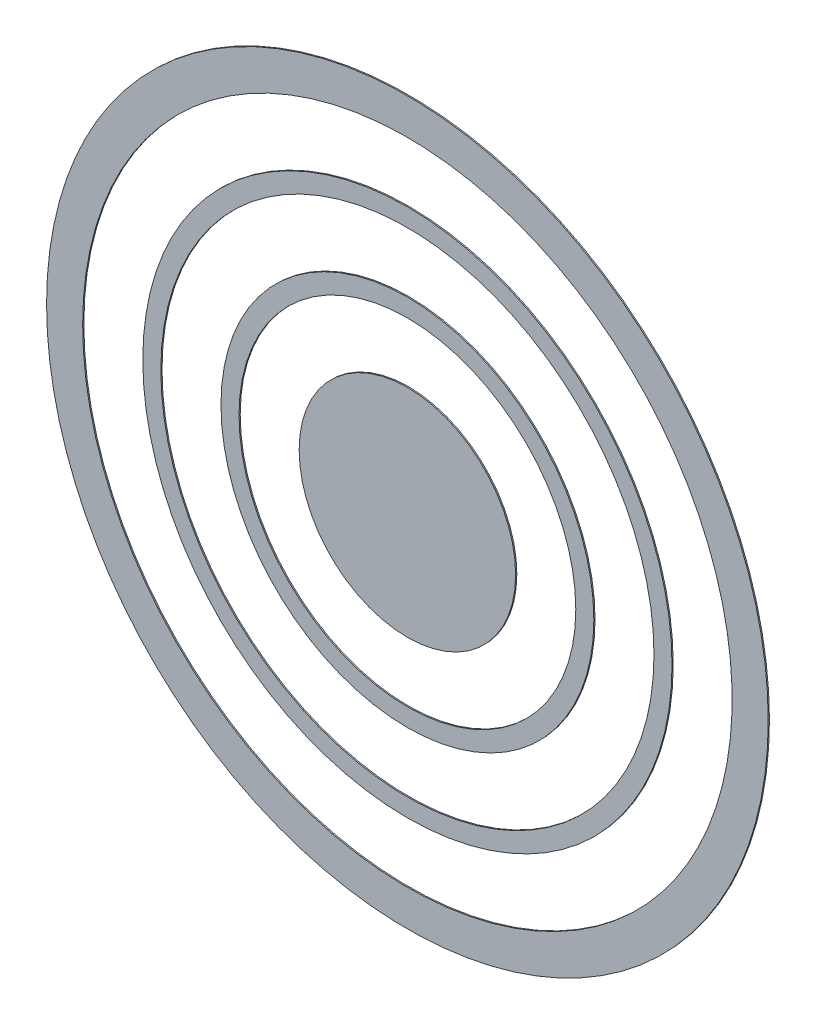
ISO-10303-21;
HEADER;
FILE_DESCRIPTION(('STEP AP214'),'2;1');
FILE_NAME('part.step','',(''),(''),'','','');
FILE_SCHEMA(('AUTOMOTIVE_DESIGN { 1 0 10303 214 1 1 1 1 }'));
ENDSEC;
DATA;
#1=APPLICATION_CONTEXT('core data for automotive mechanical design processes');
#2=APPLICATION_PROTOCOL_DEFINITION('international standard','automotive_design',2000,#1);
#3=PRODUCT_CONTEXT('',#1,'mechanical');
#4=PRODUCT('Part','Part','',(#3));
#5=PRODUCT_RELATED_PRODUCT_CATEGORY('part','',(#4));
#6=PRODUCT_DEFINITION_FORMATION('','',#4);
#7=PRODUCT_DEFINITION_CONTEXT('part definition',#1,'design');
#8=PRODUCT_DEFINITION('design','',#6,#7);
#9=PRODUCT_DEFINITION_SHAPE('','',#8);
#10=(LENGTH_UNIT() NAMED_UNIT(*) SI_UNIT(.MILLI.,.METRE.));
#11=(NAMED_UNIT(*) PLANE_ANGLE_UNIT() SI_UNIT($,.RADIAN.));
#12=(NAMED_UNIT(*) SI_UNIT($,.STERADIAN.) SOLID_ANGLE_UNIT());
#13=UNCERTAINTY_MEASURE_WITH_UNIT(LENGTH_MEASURE(1.E-05),#10,'distance_accuracy_value','');
#14=(GEOMETRIC_REPRESENTATION_CONTEXT(3) GLOBAL_UNCERTAINTY_ASSIGNED_CONTEXT((#13)) GLOBAL_UNIT_ASSIGNED_CONTEXT((#10,
#11,#12)) REPRESENTATION_CONTEXT('',''));
#15=CARTESIAN_POINT('',(0.,0.,0.));
#16=DIRECTION('',(0.,0.,1.));
#17=DIRECTION('',(1.,0.,0.));
#18=AXIS2_PLACEMENT_3D('',#15,#16,#17);
#19=CARTESIAN_POINT('',(0.,0.,0.01));
#20=DIRECTION('',(0.,0.,-1.));
#21=DIRECTION('',(-1.,0.,0.));
#22=AXIS2_PLACEMENT_3D('',#19,#20,#21);
#23=CYLINDRICAL_SURFACE('',#22,0.9);
#24=CARTESIAN_POINT('',(0.,0.,0.01));
#25=DIRECTION('',(0.,0.,1.));
#26=DIRECTION('',(1.,0.,0.));
#27=AXIS2_PLACEMENT_3D('',#24,#25,#26);
#28=CIRCLE('',#27,0.9);
#29=CARTESIAN_POINT('',(-0.9,0.,0.01));
#30=VERTEX_POINT('',#29);
#31=EDGE_CURVE('E12',#30,#30,#28,.T.);
#32=CARTESIAN_POINT('',(0.,0.,0.));
#33=DIRECTION('',(0.,0.,1.));
#34=DIRECTION('',(1.,0.,0.));
#35=AXIS2_PLACEMENT_3D('',#32,#33,#34);
#36=CIRCLE('',#35,0.9);
#37=CARTESIAN_POINT('',(-0.9,0.,0.));
#38=VERTEX_POINT('',#37);
#39=EDGE_CURVE('E87',#38,#38,#36,.T.);
#40=CARTESIAN_POINT('',(-0.9,0.,0.01));
#41=CARTESIAN_POINT('',(-0.9,0.,0.00989583333333333));
#42=CARTESIAN_POINT('',(-0.9,0.,0.00979166666666667));
#43=CARTESIAN_POINT('',(-0.9,0.,0.00958333333333333));
#44=CARTESIAN_POINT('',(-0.9,0.,0.00947916666666667));
#45=CARTESIAN_POINT('',(-0.9,0.,0.00927083333333333));
#46=CARTESIAN_POINT('',(-0.9,0.,0.00916666666666667));
#47=CARTESIAN_POINT('',(-0.9,0.,0.00895833333333333));
#48=CARTESIAN_POINT('',(-0.9,0.,0.00885416666666667));
#49=CARTESIAN_POINT('',(-0.9,0.,0.00864583333333333));
#50=CARTESIAN_POINT('',(-0.9,0.,0.00854166666666667));
#51=CARTESIAN_POINT('',(-0.9,0.,0.00833333333333333));
#52=CARTESIAN_POINT('',(-0.9,0.,0.00822916666666667));
#53=CARTESIAN_POINT('',(-0.9,0.,0.00802083333333333));
#54=CARTESIAN_POINT('',(-0.9,0.,0.00791666666666667));
#55=CARTESIAN_POINT('',(-0.9,0.,0.00770833333333333));
#56=CARTESIAN_POINT('',(-0.9,0.,0.00760416666666667));
#57=CARTESIAN_POINT('',(-0.9,0.,0.00739583333333333));
#58=CARTESIAN_POINT('',(-0.9,0.,0.00729166666666667));
#59=CARTESIAN_POINT('',(-0.9,0.,0.00708333333333333));
#60=CARTESIAN_POINT('',(-0.9,0.,0.00697916666666667));
#61=CARTESIAN_POINT('',(-0.9,0.,0.00677083333333333));
#62=CARTESIAN_POINT('',(-0.9,0.,0.00666666666666667));
#63=CARTESIAN_POINT('',(-0.9,0.,0.00645833333333333));
#64=CARTESIAN_POINT('',(-0.9,0.,0.00635416666666667));
#65=CARTESIAN_POINT('',(-0.9,0.,0.00614583333333333));
#66=CARTESIAN_POINT('',(-0.9,0.,0.00604166666666667));
#67=CARTESIAN_POINT('',(-0.9,0.,0.00583333333333333));
#68=CARTESIAN_POINT('',(-0.9,0.,0.00572916666666667));
#69=CARTESIAN_POINT('',(-0.9,0.,0.00552083333333333));
#70=CARTESIAN_POINT('',(-0.9,0.,0.00541666666666667));
#71=CARTESIAN_POINT('',(-0.9,0.,0.00520833333333333));
#72=CARTESIAN_POINT('',(-0.9,0.,0.00510416666666667));
#73=CARTESIAN_POINT('',(-0.9,0.,0.00489583333333333));
#74=CARTESIAN_POINT('',(-0.9,0.,0.00479166666666667));
#75=CARTESIAN_POINT('',(-0.9,0.,0.00458333333333333));
#76=CARTESIAN_POINT('',(-0.9,0.,0.00447916666666667));
#77=CARTESIAN_POINT('',(-0.9,0.,0.00427083333333333));
#78=CARTESIAN_POINT('',(-0.9,0.,0.00416666666666667));
#79=CARTESIAN_POINT('',(-0.9,0.,0.00395833333333333));
#80=CARTESIAN_POINT('',(-0.9,0.,0.00385416666666667));
#81=CARTESIAN_POINT('',(-0.9,0.,0.00364583333333333));
#82=CARTESIAN_POINT('',(-0.9,0.,0.00354166666666667));
#83=CARTESIAN_POINT('',(-0.9,0.,0.00333333333333333));
#84=CARTESIAN_POINT('',(-0.9,0.,0.00322916666666667));
#85=CARTESIAN_POINT('',(-0.9,0.,0.00302083333333333));
#86=CARTESIAN_POINT('',(-0.9,0.,0.00291666666666667));
#87=CARTESIAN_POINT('',(-0.9,0.,0.00270833333333333));
#88=CARTESIAN_POINT('',(-0.9,0.,0.00260416666666667));
#89=CARTESIAN_POINT('',(-0.9,0.,0.00239583333333333));
#90=CARTESIAN_POINT('',(-0.9,0.,0.00229166666666667));
#91=CARTESIAN_POINT('',(-0.9,0.,0.00208333333333333));
#92=CARTESIAN_POINT('',(-0.9,0.,0.00197916666666667));
#93=CARTESIAN_POINT('',(-0.9,0.,0.00177083333333333));
#94=CARTESIAN_POINT('',(-0.9,0.,0.00166666666666667));
#95=CARTESIAN_POINT('',(-0.9,0.,0.00145833333333333));
#96=CARTESIAN_POINT('',(-0.9,0.,0.00135416666666667));
#97=CARTESIAN_POINT('',(-0.9,0.,0.00114583333333333));
#98=CARTESIAN_POINT('',(-0.9,0.,0.00104166666666667));
#99=CARTESIAN_POINT('',(-0.9,0.,0.000833333333333334));
#100=CARTESIAN_POINT('',(-0.9,0.,0.000729166666666667));
#101=CARTESIAN_POINT('',(-0.9,0.,0.000520833333333334));
#102=CARTESIAN_POINT('',(-0.9,0.,0.000416666666666667));
#103=CARTESIAN_POINT('',(-0.9,0.,0.000208333333333334));
#104=CARTESIAN_POINT('',(-0.9,0.,0.000104166666666667));
#105=CARTESIAN_POINT('',(-0.9,0.,0.));
#106=B_SPLINE_CURVE_WITH_KNOTS('',3,(#40,#41,#42,#43,#44,#45,#46,#47,#48,#49,#50,#51,#52,#53,
#54,#55,#56,#57,#58,#59,#60,#61,#62,#63,#64,#65,#66,#67,#68,#69,#70,#71,#72,#73,#74,#75,#76,#77,
#78,#79,#80,#81,#82,#83,#84,#85,#86,#87,#88,#89,#90,#91,#92,#93,#94,#95,#96,#97,#98,#99,#100,
#101,#102,#103,#104,#105),.UNSPECIFIED.,.F.,.F.,(4,2,2,2,2,2,2,2,2,2,2,2,2,2,2,2,2,2,2,2,2,2,2,
2,2,2,2,2,2,2,2,2,4),(0.,0.000312500000000001,0.000625000000000002,0.000937500000000001,0.00125,
0.0015625,0.001875,0.0021875,0.0025,0.0028125,0.003125,0.0034375,0.00375,0.0040625,0.004375,
0.0046875,0.005,0.0053125,0.005625,0.0059375,0.00625,0.0065625,0.006875,0.0071875,0.0075,
0.0078125,0.008125,0.0084375,0.00875,0.0090625,0.009375,0.0096875,0.01),.UNSPECIFIED.);
#107=EDGE_CURVE('BSEAM84',#30,#38,#106,.T.);
#108=ORIENTED_EDGE('',*,*,#31,.F.);
#109=ORIENTED_EDGE('',*,*,#39,.T.);
#110=ORIENTED_EDGE('',*,*,#107,.T.);
#111=ORIENTED_EDGE('',*,*,#107,.F.);
#112=EDGE_LOOP('',(#108,#110,#109,#111));
#113=FACE_BOUND('',#112,.T.);
#114=ADVANCED_FACE('F84',(#113),#23,.T.);
#115=CARTESIAN_POINT('',(0.,0.,0.01));
#116=DIRECTION('',(0.,0.,1.));
#117=DIRECTION('',(1.,0.,0.));
#118=AXIS2_PLACEMENT_3D('',#115,#116,#117);
#119=PLANE('',#118);
#120=ORIENTED_EDGE('',*,*,#31,.T.);
#121=EDGE_LOOP('',(#120));
#122=FACE_BOUND('',#121,.T.);
#123=ADVANCED_FACE('F101',(#122),#119,.T.);
#124=CARTESIAN_POINT('',(0.,0.,0.));
#125=DIRECTION('',(0.,0.,1.));
#126=DIRECTION('',(1.,0.,0.));
#127=AXIS2_PLACEMENT_3D('',#124,#125,#126);
#128=PLANE('',#127);
#129=ORIENTED_EDGE('',*,*,#39,.F.);
#130=EDGE_LOOP('',(#129));
#131=FACE_BOUND('',#130,.T.);
#132=ADVANCED_FACE('F99',(#131),#128,.F.);
#133=CLOSED_SHELL('',(#114,#123,#132));
#134=MANIFOLD_SOLID_BREP('B2',#133);
#135=CARTESIAN_POINT('',(0.,0.,0.01));
#136=DIRECTION('',(0.,0.,-1.));
#137=DIRECTION('',(-1.,0.,0.));
#138=AXIS2_PLACEMENT_3D('',#135,#136,#137);
#139=CYLINDRICAL_SURFACE('',#138,1.4);
#140=CARTESIAN_POINT('',(0.,0.,0.01));
#141=DIRECTION('',(0.,0.,1.));
#142=DIRECTION('',(1.,0.,0.));
#143=AXIS2_PLACEMENT_3D('',#140,#141,#142);
#144=CIRCLE('',#143,1.4);
#145=CARTESIAN_POINT('',(-1.4,0.,0.01));
#146=VERTEX_POINT('',#145);
#147=EDGE_CURVE('E146',#146,#146,#144,.T.);
#148=CARTESIAN_POINT('',(0.,0.,0.));
#149=DIRECTION('',(0.,0.,1.));
#150=DIRECTION('',(1.,0.,0.));
#151=AXIS2_PLACEMENT_3D('',#148,#149,#150);
#152=CIRCLE('',#151,1.4);
#153=CARTESIAN_POINT('',(-1.4,0.,0.));
#154=VERTEX_POINT('',#153);
#155=EDGE_CURVE('E155',#154,#154,#152,.T.);
#156=CARTESIAN_POINT('',(-1.4,0.,0.01));
#157=CARTESIAN_POINT('',(-1.4,0.,0.00989583333333333));
#158=CARTESIAN_POINT('',(-1.4,0.,0.00979166666666667));
#159=CARTESIAN_POINT('',(-1.4,0.,0.00958333333333333));
#160=CARTESIAN_POINT('',(-1.4,0.,0.00947916666666667));
#161=CARTESIAN_POINT('',(-1.4,0.,0.00927083333333333));
#162=CARTESIAN_POINT('',(-1.4,0.,0.00916666666666667));
#163=CARTESIAN_POINT('',(-1.4,0.,0.00895833333333333));
#164=CARTESIAN_POINT('',(-1.4,0.,0.00885416666666667));
#165=CARTESIAN_POINT('',(-1.4,0.,0.00864583333333333));
#166=CARTESIAN_POINT('',(-1.4,0.,0.00854166666666667));
#167=CARTESIAN_POINT('',(-1.4,0.,0.00833333333333333));
#168=CARTESIAN_POINT('',(-1.4,0.,0.00822916666666667));
#169=CARTESIAN_POINT('',(-1.4,0.,0.00802083333333333));
#170=CARTESIAN_POINT('',(-1.4,0.,0.00791666666666667));
#171=CARTESIAN_POINT('',(-1.4,0.,0.00770833333333333));
#172=CARTESIAN_POINT('',(-1.4,0.,0.00760416666666667));
#173=CARTESIAN_POINT('',(-1.4,0.,0.00739583333333333));
#174=CARTESIAN_POINT('',(-1.4,0.,0.00729166666666667));
#175=CARTESIAN_POINT('',(-1.4,0.,0.00708333333333333));
#176=CARTESIAN_POINT('',(-1.4,0.,0.00697916666666667));
#177=CARTESIAN_POINT('',(-1.4,0.,0.00677083333333333));
#178=CARTESIAN_POINT('',(-1.4,0.,0.00666666666666667));
#179=CARTESIAN_POINT('',(-1.4,0.,0.00645833333333333));
#180=CARTESIAN_POINT('',(-1.4,0.,0.00635416666666667));
#181=CARTESIAN_POINT('',(-1.4,0.,0.00614583333333333));
#182=CARTESIAN_POINT('',(-1.4,0.,0.00604166666666667));
#183=CARTESIAN_POINT('',(-1.4,0.,0.00583333333333333));
#184=CARTESIAN_POINT('',(-1.4,0.,0.00572916666666667));
#185=CARTESIAN_POINT('',(-1.4,0.,0.00552083333333333));
#186=CARTESIAN_POINT('',(-1.4,0.,0.00541666666666667));
#187=CARTESIAN_POINT('',(-1.4,0.,0.00520833333333333));
#188=CARTESIAN_POINT('',(-1.4,0.,0.00510416666666667));
#189=CARTESIAN_POINT('',(-1.4,0.,0.00489583333333333));
#190=CARTESIAN_POINT('',(-1.4,0.,0.00479166666666667));
#191=CARTESIAN_POINT('',(-1.4,0.,0.00458333333333333));
#192=CARTESIAN_POINT('',(-1.4,0.,0.00447916666666667));
#193=CARTESIAN_POINT('',(-1.4,0.,0.00427083333333333));
#194=CARTESIAN_POINT('',(-1.4,0.,0.00416666666666667));
#195=CARTESIAN_POINT('',(-1.4,0.,0.00395833333333333));
#196=CARTESIAN_POINT('',(-1.4,0.,0.00385416666666667));
#197=CARTESIAN_POINT('',(-1.4,0.,0.00364583333333333));
#198=CARTESIAN_POINT('',(-1.4,0.,0.00354166666666667));
#199=CARTESIAN_POINT('',(-1.4,0.,0.00333333333333333));
#200=CARTESIAN_POINT('',(-1.4,0.,0.00322916666666667));
#201=CARTESIAN_POINT('',(-1.4,0.,0.00302083333333333));
#202=CARTESIAN_POINT('',(-1.4,0.,0.00291666666666667));
#203=CARTESIAN_POINT('',(-1.4,0.,0.00270833333333333));
#204=CARTESIAN_POINT('',(-1.4,0.,0.00260416666666667));
#205=CARTESIAN_POINT('',(-1.4,0.,0.00239583333333333));
#206=CARTESIAN_POINT('',(-1.4,0.,0.00229166666666667));
#207=CARTESIAN_POINT('',(-1.4,0.,0.00208333333333333));
#208=CARTESIAN_POINT('',(-1.4,0.,0.00197916666666667));
#209=CARTESIAN_POINT('',(-1.4,0.,0.00177083333333333));
#210=CARTESIAN_POINT('',(-1.4,0.,0.00166666666666667));
#211=CARTESIAN_POINT('',(-1.4,0.,0.00145833333333333));
#212=CARTESIAN_POINT('',(-1.4,0.,0.00135416666666667));
#213=CARTESIAN_POINT('',(-1.4,0.,0.00114583333333333));
#214=CARTESIAN_POINT('',(-1.4,0.,0.00104166666666667));
#215=CARTESIAN_POINT('',(-1.4,0.,0.000833333333333334));
#216=CARTESIAN_POINT('',(-1.4,0.,0.000729166666666667));
#217=CARTESIAN_POINT('',(-1.4,0.,0.000520833333333334));
#218=CARTESIAN_POINT('',(-1.4,0.,0.000416666666666667));
#219=CARTESIAN_POINT('',(-1.4,0.,0.000208333333333334));
#220=CARTESIAN_POINT('',(-1.4,0.,0.000104166666666667));
#221=CARTESIAN_POINT('',(-1.4,0.,0.));
#222=B_SPLINE_CURVE_WITH_KNOTS('',3,(#156,#157,#158,#159,#160,#161,#162,#163,#164,#165,#166,
#167,#168,#169,#170,#171,#172,#173,#174,#175,#176,#177,#178,#179,#180,#181,#182,#183,#184,#185,
#186,#187,#188,#189,#190,#191,#192,#193,#194,#195,#196,#197,#198,#199,#200,#201,#202,#203,#204,
#205,#206,#207,#208,#209,#210,#211,#212,#213,#214,#215,#216,#217,#218,#219,#220,#221),
.UNSPECIFIED.,.F.,.F.,(4,2,2,2,2,2,2,2,2,2,2,2,2,2,2,2,2,2,2,2,2,2,2,2,2,2,2,2,2,2,2,2,4),(0.,
0.000312500000000001,0.000625000000000002,0.000937500000000001,0.00125,0.0015625,0.001875,
0.0021875,0.0025,0.0028125,0.003125,0.0034375,0.00375,0.0040625,0.004375,0.0046875,0.005,
0.0053125,0.005625,0.0059375,0.00625,0.0065625,0.006875,0.0071875,0.0075,0.0078125,0.008125,
0.0084375,0.00875,0.0090625,0.009375,0.0096875,0.01),.UNSPECIFIED.);
#223=EDGE_CURVE('BSEAM138',#146,#154,#222,.T.);
#224=ORIENTED_EDGE('',*,*,#147,.T.);
#225=ORIENTED_EDGE('',*,*,#155,.F.);
#226=ORIENTED_EDGE('',*,*,#223,.T.);
#227=ORIENTED_EDGE('',*,*,#223,.F.);
#228=EDGE_LOOP('',(#224,#226,#225,#227));
#229=FACE_BOUND('',#228,.T.);
#230=ADVANCED_FACE('F138',(#229),#139,.F.);
#231=CARTESIAN_POINT('',(0.,0.,0.01));
#232=DIRECTION('',(0.,0.,-1.));
#233=DIRECTION('',(-1.,0.,0.));
#234=AXIS2_PLACEMENT_3D('',#231,#232,#233);
#235=CYLINDRICAL_SURFACE('',#234,1.55);
#236=CARTESIAN_POINT('',(0.,0.,0.01));
#237=DIRECTION('',(0.,0.,1.));
#238=DIRECTION('',(1.,0.,0.));
#239=AXIS2_PLACEMENT_3D('',#236,#237,#238);
#240=CIRCLE('',#239,1.55);
#241=CARTESIAN_POINT('',(-1.55,0.,0.01));
#242=VERTEX_POINT('',#241);
#243=EDGE_CURVE('E83',#242,#242,#240,.T.);
#244=CARTESIAN_POINT('',(0.,0.,0.));
#245=DIRECTION('',(0.,0.,1.));
#246=DIRECTION('',(1.,0.,0.));
#247=AXIS2_PLACEMENT_3D('',#244,#245,#246);
#248=CIRCLE('',#247,1.55);
#249=CARTESIAN_POINT('',(-1.55,0.,0.));
#250=VERTEX_POINT('',#249);
#251=EDGE_CURVE('E141',#250,#250,#248,.T.);
#252=CARTESIAN_POINT('',(-1.55,0.,0.01));
#253=CARTESIAN_POINT('',(-1.55,0.,0.00989583333333333));
#254=CARTESIAN_POINT('',(-1.55,0.,0.00979166666666667));
#255=CARTESIAN_POINT('',(-1.55,0.,0.00958333333333333));
#256=CARTESIAN_POINT('',(-1.55,0.,0.00947916666666667));
#257=CARTESIAN_POINT('',(-1.55,0.,0.00927083333333333));
#258=CARTESIAN_POINT('',(-1.55,0.,0.00916666666666667));
#259=CARTESIAN_POINT('',(-1.55,0.,0.00895833333333333));
#260=CARTESIAN_POINT('',(-1.55,0.,0.00885416666666667));
#261=CARTESIAN_POINT('',(-1.55,0.,0.00864583333333333));
#262=CARTESIAN_POINT('',(-1.55,0.,0.00854166666666667));
#263=CARTESIAN_POINT('',(-1.55,0.,0.00833333333333333));
#264=CARTESIAN_POINT('',(-1.55,0.,0.00822916666666667));
#265=CARTESIAN_POINT('',(-1.55,0.,0.00802083333333333));
#266=CARTESIAN_POINT('',(-1.55,0.,0.00791666666666667));
#267=CARTESIAN_POINT('',(-1.55,0.,0.00770833333333333));
#268=CARTESIAN_POINT('',(-1.55,0.,0.00760416666666667));
#269=CARTESIAN_POINT('',(-1.55,0.,0.00739583333333333));
#270=CARTESIAN_POINT('',(-1.55,0.,0.00729166666666667));
#271=CARTESIAN_POINT('',(-1.55,0.,0.00708333333333333));
#272=CARTESIAN_POINT('',(-1.55,0.,0.00697916666666667));
#273=CARTESIAN_POINT('',(-1.55,0.,0.00677083333333333));
#274=CARTESIAN_POINT('',(-1.55,0.,0.00666666666666667));
#275=CARTESIAN_POINT('',(-1.55,0.,0.00645833333333333));
#276=CARTESIAN_POINT('',(-1.55,0.,0.00635416666666667));
#277=CARTESIAN_POINT('',(-1.55,0.,0.00614583333333333));
#278=CARTESIAN_POINT('',(-1.55,0.,0.00604166666666667));
#279=CARTESIAN_POINT('',(-1.55,0.,0.00583333333333333));
#280=CARTESIAN_POINT('',(-1.55,0.,0.00572916666666667));
#281=CARTESIAN_POINT('',(-1.55,0.,0.00552083333333333));
#282=CARTESIAN_POINT('',(-1.55,0.,0.00541666666666667));
#283=CARTESIAN_POINT('',(-1.55,0.,0.00520833333333333));
#284=CARTESIAN_POINT('',(-1.55,0.,0.00510416666666667));
#285=CARTESIAN_POINT('',(-1.55,0.,0.00489583333333333));
#286=CARTESIAN_POINT('',(-1.55,0.,0.00479166666666667));
#287=CARTESIAN_POINT('',(-1.55,0.,0.00458333333333333));
#288=CARTESIAN_POINT('',(-1.55,0.,0.00447916666666667));
#289=CARTESIAN_POINT('',(-1.55,0.,0.00427083333333333));
#290=CARTESIAN_POINT('',(-1.55,0.,0.00416666666666667));
#291=CARTESIAN_POINT('',(-1.55,0.,0.00395833333333333));
#292=CARTESIAN_POINT('',(-1.55,0.,0.00385416666666667));
#293=CARTESIAN_POINT('',(-1.55,0.,0.00364583333333333));
#294=CARTESIAN_POINT('',(-1.55,0.,0.00354166666666667));
#295=CARTESIAN_POINT('',(-1.55,0.,0.00333333333333333));
#296=CARTESIAN_POINT('',(-1.55,0.,0.00322916666666667));
#297=CARTESIAN_POINT('',(-1.55,0.,0.00302083333333333));
#298=CARTESIAN_POINT('',(-1.55,0.,0.00291666666666667));
#299=CARTESIAN_POINT('',(-1.55,0.,0.00270833333333333));
#300=CARTESIAN_POINT('',(-1.55,0.,0.00260416666666667));
#301=CARTESIAN_POINT('',(-1.55,0.,0.00239583333333333));
#302=CARTESIAN_POINT('',(-1.55,0.,0.00229166666666667));
#303=CARTESIAN_POINT('',(-1.55,0.,0.00208333333333333));
#304=CARTESIAN_POINT('',(-1.55,0.,0.00197916666666667));
#305=CARTESIAN_POINT('',(-1.55,0.,0.00177083333333333));
#306=CARTESIAN_POINT('',(-1.55,0.,0.00166666666666667));
#307=CARTESIAN_POINT('',(-1.55,0.,0.00145833333333333));
#308=CARTESIAN_POINT('',(-1.55,0.,0.00135416666666667));
#309=CARTESIAN_POINT('',(-1.55,0.,0.00114583333333333));
#310=CARTESIAN_POINT('',(-1.55,0.,0.00104166666666667));
#311=CARTESIAN_POINT('',(-1.55,0.,0.000833333333333334));
#312=CARTESIAN_POINT('',(-1.55,0.,0.000729166666666667));
#313=CARTESIAN_POINT('',(-1.55,0.,0.000520833333333334));
#314=CARTESIAN_POINT('',(-1.55,0.,0.000416666666666667));
#315=CARTESIAN_POINT('',(-1.55,0.,0.000208333333333334));
#316=CARTESIAN_POINT('',(-1.55,0.,0.000104166666666667));
#317=CARTESIAN_POINT('',(-1.55,0.,0.));
#318=B_SPLINE_CURVE_WITH_KNOTS('',3,(#252,#253,#254,#255,#256,#257,#258,#259,#260,#261,#262,
#263,#264,#265,#266,#267,#268,#269,#270,#271,#272,#273,#274,#275,#276,#277,#278,#279,#280,#281,
#282,#283,#284,#285,#286,#287,#288,#289,#290,#291,#292,#293,#294,#295,#296,#297,#298,#299,#300,
#301,#302,#303,#304,#305,#306,#307,#308,#309,#310,#311,#312,#313,#314,#315,#316,#317),
.UNSPECIFIED.,.F.,.F.,(4,2,2,2,2,2,2,2,2,2,2,2,2,2,2,2,2,2,2,2,2,2,2,2,2,2,2,2,2,2,2,2,4),(0.,
0.000312500000000001,0.000625000000000002,0.000937500000000001,0.00125,0.0015625,0.001875,
0.0021875,0.0025,0.0028125,0.003125,0.0034375,0.00375,0.0040625,0.004375,0.0046875,0.005,
0.0053125,0.005625,0.0059375,0.00625,0.0065625,0.006875,0.0071875,0.0075,0.0078125,0.008125,
0.0084375,0.00875,0.0090625,0.009375,0.0096875,0.01),.UNSPECIFIED.);
#319=EDGE_CURVE('BSEAM162',#242,#250,#318,.T.);
#320=ORIENTED_EDGE('',*,*,#243,.F.);
#321=ORIENTED_EDGE('',*,*,#251,.T.);
#322=ORIENTED_EDGE('',*,*,#319,.T.);
#323=ORIENTED_EDGE('',*,*,#319,.F.);
#324=EDGE_LOOP('',(#320,#322,#321,#323));
#325=FACE_BOUND('',#324,.T.);
#326=ADVANCED_FACE('F162',(#325),#235,.T.);
#327=CARTESIAN_POINT('',(0.,0.,0.01));
#328=DIRECTION('',(0.,0.,1.));
#329=DIRECTION('',(1.,0.,0.));
#330=AXIS2_PLACEMENT_3D('',#327,#328,#329);
#331=PLANE('',#330);
#332=ORIENTED_EDGE('',*,*,#147,.F.);
#333=EDGE_LOOP('',(#332));
#334=FACE_BOUND('',#333,.T.);
#335=ORIENTED_EDGE('',*,*,#243,.T.);
#336=EDGE_LOOP('',(#335));
#337=FACE_BOUND('',#336,.T.);
#338=ADVANCED_FACE('F166',(#334,#337),#331,.T.);
#339=CARTESIAN_POINT('',(0.,0.,0.));
#340=DIRECTION('',(0.,0.,1.));
#341=DIRECTION('',(1.,0.,0.));
#342=AXIS2_PLACEMENT_3D('',#339,#340,#341);
#343=PLANE('',#342);
#344=ORIENTED_EDGE('',*,*,#155,.T.);
#345=EDGE_LOOP('',(#344));
#346=FACE_BOUND('',#345,.T.);
#347=ORIENTED_EDGE('',*,*,#251,.F.);
#348=EDGE_LOOP('',(#347));
#349=FACE_BOUND('',#348,.T.);
#350=ADVANCED_FACE('F164',(#346,#349),#343,.F.);
#351=CLOSED_SHELL('',(#230,#326,#338,#350));
#352=MANIFOLD_SOLID_BREP('B7',#351);
#353=CARTESIAN_POINT('',(0.,0.,0.01));
#354=DIRECTION('',(0.,0.,-1.));
#355=DIRECTION('',(-1.,0.,0.));
#356=AXIS2_PLACEMENT_3D('',#353,#354,#355);
#357=CYLINDRICAL_SURFACE('',#356,2.05);
#358=CARTESIAN_POINT('',(0.,0.,0.01));
#359=DIRECTION('',(0.,0.,1.));
#360=DIRECTION('',(1.,0.,0.));
#361=AXIS2_PLACEMENT_3D('',#358,#359,#360);
#362=CIRCLE('',#361,2.05);
#363=CARTESIAN_POINT('',(-2.05,0.,0.01));
#364=VERTEX_POINT('',#363);
#365=EDGE_CURVE('E223',#364,#364,#362,.T.);
#366=CARTESIAN_POINT('',(0.,0.,0.));
#367=DIRECTION('',(0.,0.,1.));
#368=DIRECTION('',(1.,0.,0.));
#369=AXIS2_PLACEMENT_3D('',#366,#367,#368);
#370=CIRCLE('',#369,2.05);
#371=CARTESIAN_POINT('',(-2.05,0.,0.));
#372=VERTEX_POINT('',#371);
#373=EDGE_CURVE('E232',#372,#372,#370,.T.);
#374=CARTESIAN_POINT('',(-2.05,0.,0.01));
#375=CARTESIAN_POINT('',(-2.05,0.,0.00989583333333333));
#376=CARTESIAN_POINT('',(-2.05,0.,0.00979166666666667));
#377=CARTESIAN_POINT('',(-2.05,0.,0.00958333333333333));
#378=CARTESIAN_POINT('',(-2.05,0.,0.00947916666666667));
#379=CARTESIAN_POINT('',(-2.05,0.,0.00927083333333333));
#380=CARTESIAN_POINT('',(-2.05,0.,0.00916666666666667));
#381=CARTESIAN_POINT('',(-2.05,0.,0.00895833333333333));
#382=CARTESIAN_POINT('',(-2.05,0.,0.00885416666666667));
#383=CARTESIAN_POINT('',(-2.05,0.,0.00864583333333333));
#384=CARTESIAN_POINT('',(-2.05,0.,0.00854166666666667));
#385=CARTESIAN_POINT('',(-2.05,0.,0.00833333333333333));
#386=CARTESIAN_POINT('',(-2.05,0.,0.00822916666666667));
#387=CARTESIAN_POINT('',(-2.05,0.,0.00802083333333333));
#388=CARTESIAN_POINT('',(-2.05,0.,0.00791666666666667));
#389=CARTESIAN_POINT('',(-2.05,0.,0.00770833333333333));
#390=CARTESIAN_POINT('',(-2.05,0.,0.00760416666666667));
#391=CARTESIAN_POINT('',(-2.05,0.,0.00739583333333333));
#392=CARTESIAN_POINT('',(-2.05,0.,0.00729166666666667));
#393=CARTESIAN_POINT('',(-2.05,0.,0.00708333333333333));
#394=CARTESIAN_POINT('',(-2.05,0.,0.00697916666666667));
#395=CARTESIAN_POINT('',(-2.05,0.,0.00677083333333333));
#396=CARTESIAN_POINT('',(-2.05,0.,0.00666666666666667));
#397=CARTESIAN_POINT('',(-2.05,0.,0.00645833333333333));
#398=CARTESIAN_POINT('',(-2.05,0.,0.00635416666666667));
#399=CARTESIAN_POINT('',(-2.05,0.,0.00614583333333333));
#400=CARTESIAN_POINT('',(-2.05,0.,0.00604166666666667));
#401=CARTESIAN_POINT('',(-2.05,0.,0.00583333333333333));
#402=CARTESIAN_POINT('',(-2.05,0.,0.00572916666666667));
#403=CARTESIAN_POINT('',(-2.05,0.,0.00552083333333333));
#404=CARTESIAN_POINT('',(-2.05,0.,0.00541666666666667));
#405=CARTESIAN_POINT('',(-2.05,0.,0.00520833333333333));
#406=CARTESIAN_POINT('',(-2.05,0.,0.00510416666666667));
#407=CARTESIAN_POINT('',(-2.05,0.,0.00489583333333333));
#408=CARTESIAN_POINT('',(-2.05,0.,0.00479166666666667));
#409=CARTESIAN_POINT('',(-2.05,0.,0.00458333333333333));
#410=CARTESIAN_POINT('',(-2.05,0.,0.00447916666666667));
#411=CARTESIAN_POINT('',(-2.05,0.,0.00427083333333333));
#412=CARTESIAN_POINT('',(-2.05,0.,0.00416666666666667));
#413=CARTESIAN_POINT('',(-2.05,0.,0.00395833333333333));
#414=CARTESIAN_POINT('',(-2.05,0.,0.00385416666666667));
#415=CARTESIAN_POINT('',(-2.05,0.,0.00364583333333333));
#416=CARTESIAN_POINT('',(-2.05,0.,0.00354166666666667));
#417=CARTESIAN_POINT('',(-2.05,0.,0.00333333333333333));
#418=CARTESIAN_POINT('',(-2.05,0.,0.00322916666666667));
#419=CARTESIAN_POINT('',(-2.05,0.,0.00302083333333333));
#420=CARTESIAN_POINT('',(-2.05,0.,0.00291666666666667));
#421=CARTESIAN_POINT('',(-2.05,0.,0.00270833333333333));
#422=CARTESIAN_POINT('',(-2.05,0.,0.00260416666666667));
#423=CARTESIAN_POINT('',(-2.05,0.,0.00239583333333333));
#424=CARTESIAN_POINT('',(-2.05,0.,0.00229166666666667));
#425=CARTESIAN_POINT('',(-2.05,0.,0.00208333333333333));
#426=CARTESIAN_POINT('',(-2.05,0.,0.00197916666666667));
#427=CARTESIAN_POINT('',(-2.05,0.,0.00177083333333333));
#428=CARTESIAN_POINT('',(-2.05,0.,0.00166666666666667));
#429=CARTESIAN_POINT('',(-2.05,0.,0.00145833333333333));
#430=CARTESIAN_POINT('',(-2.05,0.,0.00135416666666667));
#431=CARTESIAN_POINT('',(-2.05,0.,0.00114583333333333));
#432=CARTESIAN_POINT('',(-2.05,0.,0.00104166666666667));
#433=CARTESIAN_POINT('',(-2.05,0.,0.000833333333333334));
#434=CARTESIAN_POINT('',(-2.05,0.,0.000729166666666667));
#435=CARTESIAN_POINT('',(-2.05,0.,0.000520833333333334));
#436=CARTESIAN_POINT('',(-2.05,0.,0.000416666666666667));
#437=CARTESIAN_POINT('',(-2.05,0.,0.000208333333333334));
#438=CARTESIAN_POINT('',(-2.05,0.,0.000104166666666667));
#439=CARTESIAN_POINT('',(-2.05,0.,0.));
#440=B_SPLINE_CURVE_WITH_KNOTS('',3,(#374,#375,#376,#377,#378,#379,#380,#381,#382,#383,#384,
#385,#386,#387,#388,#389,#390,#391,#392,#393,#394,#395,#396,#397,#398,#399,#400,#401,#402,#403,
#404,#405,#406,#407,#408,#409,#410,#411,#412,#413,#414,#415,#416,#417,#418,#419,#420,#421,#422,
#423,#424,#425,#426,#427,#428,#429,#430,#431,#432,#433,#434,#435,#436,#437,#438,#439),
.UNSPECIFIED.,.F.,.F.,(4,2,2,2,2,2,2,2,2,2,2,2,2,2,2,2,2,2,2,2,2,2,2,2,2,2,2,2,2,2,2,2,4),(0.,
0.000312499999999999,0.000624999999999998,0.000937499999999999,0.00125,0.0015625,0.001875,
0.0021875,0.0025,0.0028125,0.003125,0.0034375,0.00375,0.0040625,0.004375,0.0046875,0.005,
0.0053125,0.005625,0.0059375,0.00625,0.0065625,0.006875,0.0071875,0.0075,0.0078125,0.008125,
0.0084375,0.00875,0.0090625,0.009375,0.0096875,0.01),.UNSPECIFIED.);
#441=EDGE_CURVE('BSEAM215',#364,#372,#440,.T.);
#442=ORIENTED_EDGE('',*,*,#365,.T.);
#443=ORIENTED_EDGE('',*,*,#373,.F.);
#444=ORIENTED_EDGE('',*,*,#441,.T.);
#445=ORIENTED_EDGE('',*,*,#441,.F.);
#446=EDGE_LOOP('',(#442,#444,#443,#445));
#447=FACE_BOUND('',#446,.T.);
#448=ADVANCED_FACE('F215',(#447),#357,.F.);
#449=CARTESIAN_POINT('',(0.,0.,0.01));
#450=DIRECTION('',(0.,0.,-1.));
#451=DIRECTION('',(-1.,0.,0.));
#452=AXIS2_PLACEMENT_3D('',#449,#450,#451);
#453=CYLINDRICAL_SURFACE('',#452,2.2);
#454=CARTESIAN_POINT('',(0.,0.,0.01));
#455=DIRECTION('',(0.,0.,1.));
#456=DIRECTION('',(1.,0.,0.));
#457=AXIS2_PLACEMENT_3D('',#454,#455,#456);
#458=CIRCLE('',#457,2.2);
#459=CARTESIAN_POINT('',(-2.2,0.,0.01));
#460=VERTEX_POINT('',#459);
#461=EDGE_CURVE('E137',#460,#460,#458,.T.);
#462=CARTESIAN_POINT('',(0.,0.,0.));
#463=DIRECTION('',(0.,0.,1.));
#464=DIRECTION('',(1.,0.,0.));
#465=AXIS2_PLACEMENT_3D('',#462,#463,#464);
#466=CIRCLE('',#465,2.2);
#467=CARTESIAN_POINT('',(-2.2,0.,0.));
#468=VERTEX_POINT('',#467);
#469=EDGE_CURVE('E218',#468,#468,#466,.T.);
#470=CARTESIAN_POINT('',(-2.2,0.,0.01));
#471=CARTESIAN_POINT('',(-2.2,0.,0.00989583333333333));
#472=CARTESIAN_POINT('',(-2.2,0.,0.00979166666666667));
#473=CARTESIAN_POINT('',(-2.2,0.,0.00958333333333333));
#474=CARTESIAN_POINT('',(-2.2,0.,0.00947916666666667));
#475=CARTESIAN_POINT('',(-2.2,0.,0.00927083333333333));
#476=CARTESIAN_POINT('',(-2.2,0.,0.00916666666666667));
#477=CARTESIAN_POINT('',(-2.2,0.,0.00895833333333333));
#478=CARTESIAN_POINT('',(-2.2,0.,0.00885416666666667));
#479=CARTESIAN_POINT('',(-2.2,0.,0.00864583333333333));
#480=CARTESIAN_POINT('',(-2.2,0.,0.00854166666666667));
#481=CARTESIAN_POINT('',(-2.2,0.,0.00833333333333333));
#482=CARTESIAN_POINT('',(-2.2,0.,0.00822916666666667));
#483=CARTESIAN_POINT('',(-2.2,0.,0.00802083333333333));
#484=CARTESIAN_POINT('',(-2.2,0.,0.00791666666666667));
#485=CARTESIAN_POINT('',(-2.2,0.,0.00770833333333333));
#486=CARTESIAN_POINT('',(-2.2,0.,0.00760416666666667));
#487=CARTESIAN_POINT('',(-2.2,0.,0.00739583333333333));
#488=CARTESIAN_POINT('',(-2.2,0.,0.00729166666666667));
#489=CARTESIAN_POINT('',(-2.2,0.,0.00708333333333333));
#490=CARTESIAN_POINT('',(-2.2,0.,0.00697916666666667));
#491=CARTESIAN_POINT('',(-2.2,0.,0.00677083333333333));
#492=CARTESIAN_POINT('',(-2.2,0.,0.00666666666666667));
#493=CARTESIAN_POINT('',(-2.2,0.,0.00645833333333333));
#494=CARTESIAN_POINT('',(-2.2,0.,0.00635416666666667));
#495=CARTESIAN_POINT('',(-2.2,0.,0.00614583333333333));
#496=CARTESIAN_POINT('',(-2.2,0.,0.00604166666666667));
#497=CARTESIAN_POINT('',(-2.2,0.,0.00583333333333333));
#498=CARTESIAN_POINT('',(-2.2,0.,0.00572916666666667));
#499=CARTESIAN_POINT('',(-2.2,0.,0.00552083333333333));
#500=CARTESIAN_POINT('',(-2.2,0.,0.00541666666666667));
#501=CARTESIAN_POINT('',(-2.2,0.,0.00520833333333333));
#502=CARTESIAN_POINT('',(-2.2,0.,0.00510416666666667));
#503=CARTESIAN_POINT('',(-2.2,0.,0.00489583333333333));
#504=CARTESIAN_POINT('',(-2.2,0.,0.00479166666666667));
#505=CARTESIAN_POINT('',(-2.2,0.,0.00458333333333333));
#506=CARTESIAN_POINT('',(-2.2,0.,0.00447916666666667));
#507=CARTESIAN_POINT('',(-2.2,0.,0.00427083333333333));
#508=CARTESIAN_POINT('',(-2.2,0.,0.00416666666666667));
#509=CARTESIAN_POINT('',(-2.2,0.,0.00395833333333333));
#510=CARTESIAN_POINT('',(-2.2,0.,0.00385416666666667));
#511=CARTESIAN_POINT('',(-2.2,0.,0.00364583333333333));
#512=CARTESIAN_POINT('',(-2.2,0.,0.00354166666666667));
#513=CARTESIAN_POINT('',(-2.2,0.,0.00333333333333333));
#514=CARTESIAN_POINT('',(-2.2,0.,0.00322916666666667));
#515=CARTESIAN_POINT('',(-2.2,0.,0.00302083333333333));
#516=CARTESIAN_POINT('',(-2.2,0.,0.00291666666666667));
#517=CARTESIAN_POINT('',(-2.2,0.,0.00270833333333333));
#518=CARTESIAN_POINT('',(-2.2,0.,0.00260416666666667));
#519=CARTESIAN_POINT('',(-2.2,0.,0.00239583333333333));
#520=CARTESIAN_POINT('',(-2.2,0.,0.00229166666666667));
#521=CARTESIAN_POINT('',(-2.2,0.,0.00208333333333333));
#522=CARTESIAN_POINT('',(-2.2,0.,0.00197916666666667));
#523=CARTESIAN_POINT('',(-2.2,0.,0.00177083333333333));
#524=CARTESIAN_POINT('',(-2.2,0.,0.00166666666666667));
#525=CARTESIAN_POINT('',(-2.2,0.,0.00145833333333333));
#526=CARTESIAN_POINT('',(-2.2,0.,0.00135416666666667));
#527=CARTESIAN_POINT('',(-2.2,0.,0.00114583333333333));
#528=CARTESIAN_POINT('',(-2.2,0.,0.00104166666666667));
#529=CARTESIAN_POINT('',(-2.2,0.,0.000833333333333334));
#530=CARTESIAN_POINT('',(-2.2,0.,0.000729166666666667));
#531=CARTESIAN_POINT('',(-2.2,0.,0.000520833333333334));
#532=CARTESIAN_POINT('',(-2.2,0.,0.000416666666666667));
#533=CARTESIAN_POINT('',(-2.2,0.,0.000208333333333334));
#534=CARTESIAN_POINT('',(-2.2,0.,0.000104166666666667));
#535=CARTESIAN_POINT('',(-2.2,0.,0.));
#536=B_SPLINE_CURVE_WITH_KNOTS('',3,(#470,#471,#472,#473,#474,#475,#476,#477,#478,#479,#480,
#481,#482,#483,#484,#485,#486,#487,#488,#489,#490,#491,#492,#493,#494,#495,#496,#497,#498,#499,
#500,#501,#502,#503,#504,#505,#506,#507,#508,#509,#510,#511,#512,#513,#514,#515,#516,#517,#518,
#519,#520,#521,#522,#523,#524,#525,#526,#527,#528,#529,#530,#531,#532,#533,#534,#535),
.UNSPECIFIED.,.F.,.F.,(4,2,2,2,2,2,2,2,2,2,2,2,2,2,2,2,2,2,2,2,2,2,2,2,2,2,2,2,2,2,2,2,4),(0.,
0.000312500000000001,0.000625000000000002,0.000937500000000001,0.00125,0.0015625,0.001875,
0.0021875,0.0025,0.0028125,0.003125,0.0034375,0.00375,0.0040625,0.004375,0.0046875,0.005,
0.0053125,0.005625,0.0059375,0.00625,0.0065625,0.006875,0.0071875,0.0075,0.0078125,0.008125,
0.0084375,0.00875,0.0090625,0.009375,0.0096875,0.01),.UNSPECIFIED.);
#537=EDGE_CURVE('BSEAM239',#460,#468,#536,.T.);
#538=ORIENTED_EDGE('',*,*,#461,.F.);
#539=ORIENTED_EDGE('',*,*,#469,.T.);
#540=ORIENTED_EDGE('',*,*,#537,.T.);
#541=ORIENTED_EDGE('',*,*,#537,.F.);
#542=EDGE_LOOP('',(#538,#540,#539,#541));
#543=FACE_BOUND('',#542,.T.);
#544=ADVANCED_FACE('F239',(#543),#453,.T.);
#545=CARTESIAN_POINT('',(0.,0.,0.01));
#546=DIRECTION('',(0.,0.,1.));
#547=DIRECTION('',(1.,0.,0.));
#548=AXIS2_PLACEMENT_3D('',#545,#546,#547);
#549=PLANE('',#548);
#550=ORIENTED_EDGE('',*,*,#365,.F.);
#551=EDGE_LOOP('',(#550));
#552=FACE_BOUND('',#551,.T.);
#553=ORIENTED_EDGE('',*,*,#461,.T.);
#554=EDGE_LOOP('',(#553));
#555=FACE_BOUND('',#554,.T.);
#556=ADVANCED_FACE('F243',(#552,#555),#549,.T.);
#557=CARTESIAN_POINT('',(0.,0.,0.));
#558=DIRECTION('',(0.,0.,1.));
#559=DIRECTION('',(1.,0.,0.));
#560=AXIS2_PLACEMENT_3D('',#557,#558,#559);
#561=PLANE('',#560);
#562=ORIENTED_EDGE('',*,*,#373,.T.);
#563=EDGE_LOOP('',(#562));
#564=FACE_BOUND('',#563,.T.);
#565=ORIENTED_EDGE('',*,*,#469,.F.);
#566=EDGE_LOOP('',(#565));
#567=FACE_BOUND('',#566,.T.);
#568=ADVANCED_FACE('F241',(#564,#567),#561,.F.);
#569=CLOSED_SHELL('',(#448,#544,#556,#568));
#570=MANIFOLD_SOLID_BREP('B78',#569);
#571=CARTESIAN_POINT('',(0.,0.,0.01));
#572=DIRECTION('',(0.,0.,-1.));
#573=DIRECTION('',(-1.,0.,0.));
#574=AXIS2_PLACEMENT_3D('',#571,#572,#573);
#575=CYLINDRICAL_SURFACE('',#574,2.7);
#576=CARTESIAN_POINT('',(0.,0.,0.01));
#577=DIRECTION('',(0.,0.,1.));
#578=DIRECTION('',(1.,0.,0.));
#579=AXIS2_PLACEMENT_3D('',#576,#577,#578);
#580=CIRCLE('',#579,2.7);
#581=CARTESIAN_POINT('',(-2.7,0.,0.01));
#582=VERTEX_POINT('',#581);
#583=EDGE_CURVE('E293',#582,#582,#580,.T.);
#584=CARTESIAN_POINT('',(0.,0.,0.));
#585=DIRECTION('',(0.,0.,1.));
#586=DIRECTION('',(1.,0.,0.));
#587=AXIS2_PLACEMENT_3D('',#584,#585,#586);
#588=CIRCLE('',#587,2.7);
#589=CARTESIAN_POINT('',(-2.7,0.,0.));
#590=VERTEX_POINT('',#589);
#591=EDGE_CURVE('E300',#590,#590,#588,.T.);
#592=CARTESIAN_POINT('',(-2.7,0.,0.01));
#593=CARTESIAN_POINT('',(-2.7,0.,0.00989583333333333));
#594=CARTESIAN_POINT('',(-2.7,0.,0.00979166666666667));
#595=CARTESIAN_POINT('',(-2.7,0.,0.00958333333333333));
#596=CARTESIAN_POINT('',(-2.7,0.,0.00947916666666667));
#597=CARTESIAN_POINT('',(-2.7,0.,0.00927083333333333));
#598=CARTESIAN_POINT('',(-2.7,0.,0.00916666666666667));
#599=CARTESIAN_POINT('',(-2.7,0.,0.00895833333333333));
#600=CARTESIAN_POINT('',(-2.7,0.,0.00885416666666667));
#601=CARTESIAN_POINT('',(-2.7,0.,0.00864583333333333));
#602=CARTESIAN_POINT('',(-2.7,0.,0.00854166666666667));
#603=CARTESIAN_POINT('',(-2.7,0.,0.00833333333333333));
#604=CARTESIAN_POINT('',(-2.7,0.,0.00822916666666667));
#605=CARTESIAN_POINT('',(-2.7,0.,0.00802083333333333));
#606=CARTESIAN_POINT('',(-2.7,0.,0.00791666666666667));
#607=CARTESIAN_POINT('',(-2.7,0.,0.00770833333333333));
#608=CARTESIAN_POINT('',(-2.7,0.,0.00760416666666667));
#609=CARTESIAN_POINT('',(-2.7,0.,0.00739583333333333));
#610=CARTESIAN_POINT('',(-2.7,0.,0.00729166666666667));
#611=CARTESIAN_POINT('',(-2.7,0.,0.00708333333333333));
#612=CARTESIAN_POINT('',(-2.7,0.,0.00697916666666667));
#613=CARTESIAN_POINT('',(-2.7,0.,0.00677083333333333));
#614=CARTESIAN_POINT('',(-2.7,0.,0.00666666666666667));
#615=CARTESIAN_POINT('',(-2.7,0.,0.00645833333333333));
#616=CARTESIAN_POINT('',(-2.7,0.,0.00635416666666667));
#617=CARTESIAN_POINT('',(-2.7,0.,0.00614583333333333));
#618=CARTESIAN_POINT('',(-2.7,0.,0.00604166666666667));
#619=CARTESIAN_POINT('',(-2.7,0.,0.00583333333333333));
#620=CARTESIAN_POINT('',(-2.7,0.,0.00572916666666667));
#621=CARTESIAN_POINT('',(-2.7,0.,0.00552083333333333));
#622=CARTESIAN_POINT('',(-2.7,0.,0.00541666666666667));
#623=CARTESIAN_POINT('',(-2.7,0.,0.00520833333333333));
#624=CARTESIAN_POINT('',(-2.7,0.,0.00510416666666667));
#625=CARTESIAN_POINT('',(-2.7,0.,0.00489583333333333));
#626=CARTESIAN_POINT('',(-2.7,0.,0.00479166666666667));
#627=CARTESIAN_POINT('',(-2.7,0.,0.00458333333333333));
#628=CARTESIAN_POINT('',(-2.7,0.,0.00447916666666667));
#629=CARTESIAN_POINT('',(-2.7,0.,0.00427083333333333));
#630=CARTESIAN_POINT('',(-2.7,0.,0.00416666666666667));
#631=CARTESIAN_POINT('',(-2.7,0.,0.00395833333333333));
#632=CARTESIAN_POINT('',(-2.7,0.,0.00385416666666667));
#633=CARTESIAN_POINT('',(-2.7,0.,0.00364583333333333));
#634=CARTESIAN_POINT('',(-2.7,0.,0.00354166666666667));
#635=CARTESIAN_POINT('',(-2.7,0.,0.00333333333333333));
#636=CARTESIAN_POINT('',(-2.7,0.,0.00322916666666667));
#637=CARTESIAN_POINT('',(-2.7,0.,0.00302083333333333));
#638=CARTESIAN_POINT('',(-2.7,0.,0.00291666666666667));
#639=CARTESIAN_POINT('',(-2.7,0.,0.00270833333333333));
#640=CARTESIAN_POINT('',(-2.7,0.,0.00260416666666667));
#641=CARTESIAN_POINT('',(-2.7,0.,0.00239583333333333));
#642=CARTESIAN_POINT('',(-2.7,0.,0.00229166666666667));
#643=CARTESIAN_POINT('',(-2.7,0.,0.00208333333333333));
#644=CARTESIAN_POINT('',(-2.7,0.,0.00197916666666667));
#645=CARTESIAN_POINT('',(-2.7,0.,0.00177083333333333));
#646=CARTESIAN_POINT('',(-2.7,0.,0.00166666666666667));
#647=CARTESIAN_POINT('',(-2.7,0.,0.00145833333333333));
#648=CARTESIAN_POINT('',(-2.7,0.,0.00135416666666667));
#649=CARTESIAN_POINT('',(-2.7,0.,0.00114583333333333));
#650=CARTESIAN_POINT('',(-2.7,0.,0.00104166666666667));
#651=CARTESIAN_POINT('',(-2.7,0.,0.000833333333333334));
#652=CARTESIAN_POINT('',(-2.7,0.,0.000729166666666667));
#653=CARTESIAN_POINT('',(-2.7,0.,0.000520833333333334));
#654=CARTESIAN_POINT('',(-2.7,0.,0.000416666666666667));
#655=CARTESIAN_POINT('',(-2.7,0.,0.000208333333333334));
#656=CARTESIAN_POINT('',(-2.7,0.,0.000104166666666667));
#657=CARTESIAN_POINT('',(-2.7,0.,0.));
#658=B_SPLINE_CURVE_WITH_KNOTS('',3,(#592,#593,#594,#595,#596,#597,#598,#599,#600,#601,#602,
#603,#604,#605,#606,#607,#608,#609,#610,#611,#612,#613,#614,#615,#616,#617,#618,#619,#620,#621,
#622,#623,#624,#625,#626,#627,#628,#629,#630,#631,#632,#633,#634,#635,#636,#637,#638,#639,#640,
#641,#642,#643,#644,#645,#646,#647,#648,#649,#650,#651,#652,#653,#654,#655,#656,#657),
.UNSPECIFIED.,.F.,.F.,(4,2,2,2,2,2,2,2,2,2,2,2,2,2,2,2,2,2,2,2,2,2,2,2,2,2,2,2,2,2,2,2,4),(0.,
0.000312500000000001,0.000625000000000002,0.000937500000000001,0.00125,0.0015625,0.001875,
0.0021875,0.0025,0.0028125,0.003125,0.0034375,0.00375,0.0040625,0.004375,0.0046875,0.005,
0.0053125,0.005625,0.0059375,0.00625,0.0065625,0.006875,0.0071875,0.0075,0.0078125,0.008125,
0.0084375,0.00875,0.0090625,0.009375,0.0096875,0.01),.UNSPECIFIED.);
#659=EDGE_CURVE('BSEAM285',#582,#590,#658,.T.);
#660=ORIENTED_EDGE('',*,*,#583,.T.);
#661=ORIENTED_EDGE('',*,*,#591,.F.);
#662=ORIENTED_EDGE('',*,*,#659,.T.);
#663=ORIENTED_EDGE('',*,*,#659,.F.);
#664=EDGE_LOOP('',(#660,#662,#661,#663));
#665=FACE_BOUND('',#664,.T.);
#666=ADVANCED_FACE('F285',(#665),#575,.F.);
#667=CARTESIAN_POINT('',(0.,0.,0.01));
#668=DIRECTION('',(0.,0.,-1.));
#669=DIRECTION('',(-1.,0.,0.));
#670=AXIS2_PLACEMENT_3D('',#667,#668,#669);
#671=CYLINDRICAL_SURFACE('',#670,3.);
#672=CARTESIAN_POINT('',(0.,0.,0.01));
#673=DIRECTION('',(0.,0.,1.));
#674=DIRECTION('',(1.,0.,0.));
#675=AXIS2_PLACEMENT_3D('',#672,#673,#674);
#676=CIRCLE('',#675,3.);
#677=CARTESIAN_POINT('',(-3.,0.,0.01));
#678=VERTEX_POINT('',#677);
#679=EDGE_CURVE('E214',#678,#678,#676,.T.);
#680=CARTESIAN_POINT('',(0.,0.,0.));
#681=DIRECTION('',(0.,0.,1.));
#682=DIRECTION('',(1.,0.,0.));
#683=AXIS2_PLACEMENT_3D('',#680,#681,#682);
#684=CIRCLE('',#683,3.);
#685=CARTESIAN_POINT('',(-3.,0.,0.));
#686=VERTEX_POINT('',#685);
#687=EDGE_CURVE('E288',#686,#686,#684,.T.);
#688=CARTESIAN_POINT('',(-3.,0.,0.01));
#689=CARTESIAN_POINT('',(-3.,0.,0.00989583333333333));
#690=CARTESIAN_POINT('',(-3.,0.,0.00979166666666667));
#691=CARTESIAN_POINT('',(-3.,0.,0.00958333333333333));
#692=CARTESIAN_POINT('',(-3.,0.,0.00947916666666667));
#693=CARTESIAN_POINT('',(-3.,0.,0.00927083333333333));
#694=CARTESIAN_POINT('',(-3.,0.,0.00916666666666667));
#695=CARTESIAN_POINT('',(-3.,0.,0.00895833333333333));
#696=CARTESIAN_POINT('',(-3.,0.,0.00885416666666667));
#697=CARTESIAN_POINT('',(-3.,0.,0.00864583333333333));
#698=CARTESIAN_POINT('',(-3.,0.,0.00854166666666667));
#699=CARTESIAN_POINT('',(-3.,0.,0.00833333333333333));
#700=CARTESIAN_POINT('',(-3.,0.,0.00822916666666667));
#701=CARTESIAN_POINT('',(-3.,0.,0.00802083333333333));
#702=CARTESIAN_POINT('',(-3.,0.,0.00791666666666667));
#703=CARTESIAN_POINT('',(-3.,0.,0.00770833333333333));
#704=CARTESIAN_POINT('',(-3.,0.,0.00760416666666667));
#705=CARTESIAN_POINT('',(-3.,0.,0.00739583333333333));
#706=CARTESIAN_POINT('',(-3.,0.,0.00729166666666667));
#707=CARTESIAN_POINT('',(-3.,0.,0.00708333333333333));
#708=CARTESIAN_POINT('',(-3.,0.,0.00697916666666667));
#709=CARTESIAN_POINT('',(-3.,0.,0.00677083333333333));
#710=CARTESIAN_POINT('',(-3.,0.,0.00666666666666667));
#711=CARTESIAN_POINT('',(-3.,0.,0.00645833333333333));
#712=CARTESIAN_POINT('',(-3.,0.,0.00635416666666667));
#713=CARTESIAN_POINT('',(-3.,0.,0.00614583333333333));
#714=CARTESIAN_POINT('',(-3.,0.,0.00604166666666667));
#715=CARTESIAN_POINT('',(-3.,0.,0.00583333333333333));
#716=CARTESIAN_POINT('',(-3.,0.,0.00572916666666667));
#717=CARTESIAN_POINT('',(-3.,0.,0.00552083333333333));
#718=CARTESIAN_POINT('',(-3.,0.,0.00541666666666667));
#719=CARTESIAN_POINT('',(-3.,0.,0.00520833333333333));
#720=CARTESIAN_POINT('',(-3.,0.,0.00510416666666667));
#721=CARTESIAN_POINT('',(-3.,0.,0.00489583333333333));
#722=CARTESIAN_POINT('',(-3.,0.,0.00479166666666667));
#723=CARTESIAN_POINT('',(-3.,0.,0.00458333333333333));
#724=CARTESIAN_POINT('',(-3.,0.,0.00447916666666667));
#725=CARTESIAN_POINT('',(-3.,0.,0.00427083333333333));
#726=CARTESIAN_POINT('',(-3.,0.,0.00416666666666667));
#727=CARTESIAN_POINT('',(-3.,0.,0.00395833333333333));
#728=CARTESIAN_POINT('',(-3.,0.,0.00385416666666667));
#729=CARTESIAN_POINT('',(-3.,0.,0.00364583333333333));
#730=CARTESIAN_POINT('',(-3.,0.,0.00354166666666667));
#731=CARTESIAN_POINT('',(-3.,0.,0.00333333333333333));
#732=CARTESIAN_POINT('',(-3.,0.,0.00322916666666667));
#733=CARTESIAN_POINT('',(-3.,0.,0.00302083333333333));
#734=CARTESIAN_POINT('',(-3.,0.,0.00291666666666667));
#735=CARTESIAN_POINT('',(-3.,0.,0.00270833333333333));
#736=CARTESIAN_POINT('',(-3.,0.,0.00260416666666667));
#737=CARTESIAN_POINT('',(-3.,0.,0.00239583333333333));
#738=CARTESIAN_POINT('',(-3.,0.,0.00229166666666667));
#739=CARTESIAN_POINT('',(-3.,0.,0.00208333333333333));
#740=CARTESIAN_POINT('',(-3.,0.,0.00197916666666667));
#741=CARTESIAN_POINT('',(-3.,0.,0.00177083333333333));
#742=CARTESIAN_POINT('',(-3.,0.,0.00166666666666667));
#743=CARTESIAN_POINT('',(-3.,0.,0.00145833333333333));
#744=CARTESIAN_POINT('',(-3.,0.,0.00135416666666667));
#745=CARTESIAN_POINT('',(-3.,0.,0.00114583333333333));
#746=CARTESIAN_POINT('',(-3.,0.,0.00104166666666667));
#747=CARTESIAN_POINT('',(-3.,0.,0.000833333333333334));
#748=CARTESIAN_POINT('',(-3.,0.,0.000729166666666667));
#749=CARTESIAN_POINT('',(-3.,0.,0.000520833333333334));
#750=CARTESIAN_POINT('',(-3.,0.,0.000416666666666667));
#751=CARTESIAN_POINT('',(-3.,0.,0.000208333333333334));
#752=CARTESIAN_POINT('',(-3.,0.,0.000104166666666667));
#753=CARTESIAN_POINT('',(-3.,0.,0.));
#754=B_SPLINE_CURVE_WITH_KNOTS('',3,(#688,#689,#690,#691,#692,#693,#694,#695,#696,#697,#698,
#699,#700,#701,#702,#703,#704,#705,#706,#707,#708,#709,#710,#711,#712,#713,#714,#715,#716,#717,
#718,#719,#720,#721,#722,#723,#724,#725,#726,#727,#728,#729,#730,#731,#732,#733,#734,#735,#736,
#737,#738,#739,#740,#741,#742,#743,#744,#745,#746,#747,#748,#749,#750,#751,#752,#753),
.UNSPECIFIED.,.F.,.F.,(4,2,2,2,2,2,2,2,2,2,2,2,2,2,2,2,2,2,2,2,2,2,2,2,2,2,2,2,2,2,2,2,4),(0.,
0.000312500000000001,0.000625000000000002,0.000937500000000001,0.00125,0.0015625,0.001875,
0.0021875,0.0025,0.0028125,0.003125,0.0034375,0.00375,0.0040625,0.004375,0.0046875,0.005,
0.0053125,0.005625,0.0059375,0.00625,0.0065625,0.006875,0.0071875,0.0075,0.0078125,0.008125,
0.0084375,0.00875,0.0090625,0.009375,0.0096875,0.01),.UNSPECIFIED.);
#755=EDGE_CURVE('BSEAM309',#678,#686,#754,.T.);
#756=ORIENTED_EDGE('',*,*,#679,.F.);
#757=ORIENTED_EDGE('',*,*,#687,.T.);
#758=ORIENTED_EDGE('',*,*,#755,.T.);
#759=ORIENTED_EDGE('',*,*,#755,.F.);
#760=EDGE_LOOP('',(#756,#758,#757,#759));
#761=FACE_BOUND('',#760,.T.);
#762=ADVANCED_FACE('F309',(#761),#671,.T.);
#763=CARTESIAN_POINT('',(0.,0.,0.01));
#764=DIRECTION('',(0.,0.,1.));
#765=DIRECTION('',(1.,0.,0.));
#766=AXIS2_PLACEMENT_3D('',#763,#764,#765);
#767=PLANE('',#766);
#768=ORIENTED_EDGE('',*,*,#583,.F.);
#769=EDGE_LOOP('',(#768));
#770=FACE_BOUND('',#769,.T.);
#771=ORIENTED_EDGE('',*,*,#679,.T.);
#772=EDGE_LOOP('',(#771));
#773=FACE_BOUND('',#772,.T.);
#774=ADVANCED_FACE('F313',(#770,#773),#767,.T.);
#775=CARTESIAN_POINT('',(0.,0.,0.));
#776=DIRECTION('',(0.,0.,1.));
#777=DIRECTION('',(1.,0.,0.));
#778=AXIS2_PLACEMENT_3D('',#775,#776,#777);
#779=PLANE('',#778);
#780=ORIENTED_EDGE('',*,*,#591,.T.);
#781=EDGE_LOOP('',(#780));
#782=FACE_BOUND('',#781,.T.);
#783=ORIENTED_EDGE('',*,*,#687,.F.);
#784=EDGE_LOOP('',(#783));
#785=FACE_BOUND('',#784,.T.);
#786=ADVANCED_FACE('F311',(#782,#785),#779,.F.);
#787=CLOSED_SHELL('',(#666,#762,#774,#786));
#788=MANIFOLD_SOLID_BREP('B132',#787);
#789=ADVANCED_BREP_SHAPE_REPRESENTATION('',(#18,#134,#352,#570,#788),#14);
#790=SHAPE_DEFINITION_REPRESENTATION(#9,#789);
ENDSEC;
END-ISO-10303-21;
